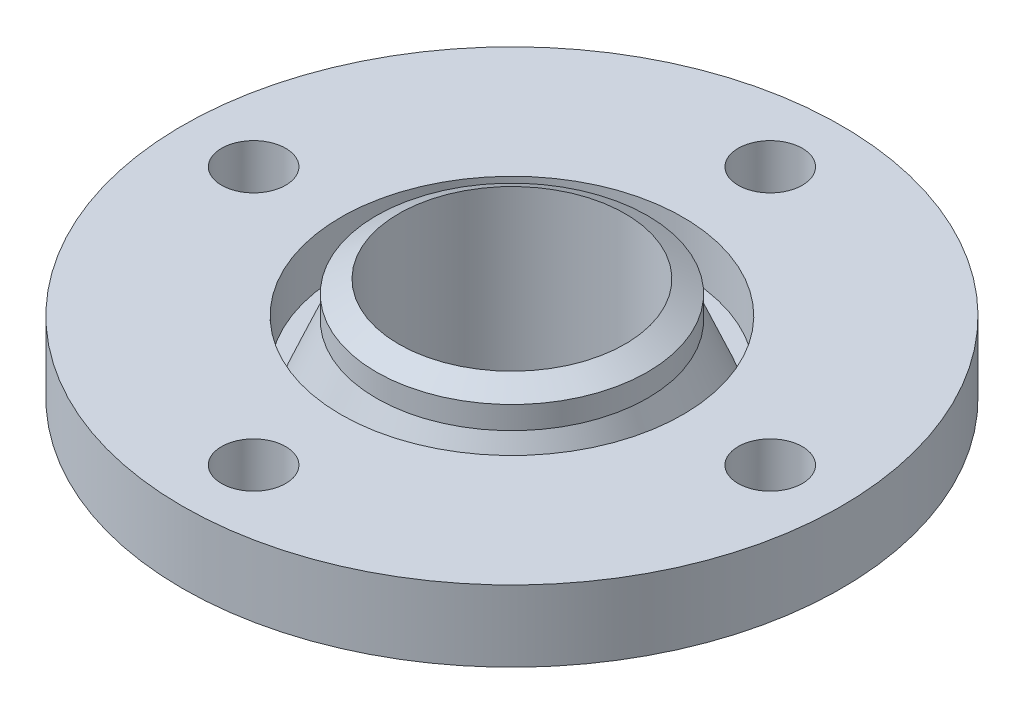
ISO-10303-21;
HEADER;
FILE_DESCRIPTION(('STEP AP214'),'2;1');
FILE_NAME('part.step','',(''),(''),'','','');
FILE_SCHEMA(('AUTOMOTIVE_DESIGN { 1 0 10303 214 1 1 1 1 }'));
ENDSEC;
DATA;
#1=APPLICATION_CONTEXT('core data for automotive mechanical design processes');
#2=APPLICATION_PROTOCOL_DEFINITION('international standard','automotive_design',2000,#1);
#3=PRODUCT_CONTEXT('',#1,'mechanical');
#4=PRODUCT('Part','Part','',(#3));
#5=PRODUCT_RELATED_PRODUCT_CATEGORY('part','',(#4));
#6=PRODUCT_DEFINITION_FORMATION('','',#4);
#7=PRODUCT_DEFINITION_CONTEXT('part definition',#1,'design');
#8=PRODUCT_DEFINITION('design','',#6,#7);
#9=PRODUCT_DEFINITION_SHAPE('','',#8);
#10=(LENGTH_UNIT() NAMED_UNIT(*) SI_UNIT(.MILLI.,.METRE.));
#11=(NAMED_UNIT(*) PLANE_ANGLE_UNIT() SI_UNIT($,.RADIAN.));
#12=(NAMED_UNIT(*) SI_UNIT($,.STERADIAN.) SOLID_ANGLE_UNIT());
#13=UNCERTAINTY_MEASURE_WITH_UNIT(LENGTH_MEASURE(1.E-05),#10,'distance_accuracy_value','');
#14=(GEOMETRIC_REPRESENTATION_CONTEXT(3) GLOBAL_UNCERTAINTY_ASSIGNED_CONTEXT((#13)) GLOBAL_UNIT_ASSIGNED_CONTEXT((#10,
#11,#12)) REPRESENTATION_CONTEXT('',''));
#15=CARTESIAN_POINT('',(0.,0.,0.));
#16=DIRECTION('',(0.,0.,1.));
#17=DIRECTION('',(1.,0.,0.));
#18=AXIS2_PLACEMENT_3D('',#15,#16,#17);
#19=CARTESIAN_POINT('',(0.,0.,0.));
#20=DIRECTION('',(0.,-1.,0.));
#21=DIRECTION('',(0.,0.,-1.));
#22=AXIS2_PLACEMENT_3D('',#19,#20,#21);
#23=CONICAL_SURFACE('',#22,31.75,1.04719755119659);
#24=CARTESIAN_POINT('',(0.,-3.63730669589472,0.));
#25=DIRECTION('',(0.,1.,0.));
#26=DIRECTION('',(0.,0.,1.));
#27=AXIS2_PLACEMENT_3D('',#24,#25,#26);
#28=CIRCLE('',#27,38.05);
#29=CARTESIAN_POINT('',(0.,-3.63730669589472,38.05));
#30=VERTEX_POINT('',#29);
#31=EDGE_CURVE('E10',#30,#30,#28,.T.);
#32=ORIENTED_EDGE('',*,*,#31,.T.);
#33=EDGE_LOOP('',(#32));
#34=FACE_BOUND('',#33,.T.);
#35=CARTESIAN_POINT('',(0.,0.,0.));
#36=DIRECTION('',(0.,1.,0.));
#37=DIRECTION('',(0.,0.,1.));
#38=AXIS2_PLACEMENT_3D('',#35,#36,#37);
#39=CIRCLE('',#38,31.75);
#40=CARTESIAN_POINT('',(0.,0.,31.75));
#41=VERTEX_POINT('',#40);
#42=EDGE_CURVE('E78',#41,#41,#39,.T.);
#43=ORIENTED_EDGE('',*,*,#42,.F.);
#44=EDGE_LOOP('',(#43));
#45=FACE_BOUND('',#44,.T.);
#46=ADVANCED_FACE('F37',(#34,#45),#23,.T.);
#47=CARTESIAN_POINT('',(0.,0.,0.));
#48=DIRECTION('',(0.,1.,0.));
#49=DIRECTION('',(0.,0.,1.));
#50=AXIS2_PLACEMENT_3D('',#47,#48,#49);
#51=CYLINDRICAL_SURFACE('',#50,38.05);
#52=CARTESIAN_POINT('',(0.,-10.,0.));
#53=DIRECTION('',(0.,1.,0.));
#54=DIRECTION('',(0.,0.,1.));
#55=AXIS2_PLACEMENT_3D('',#52,#53,#54);
#56=CIRCLE('',#55,38.05);
#57=CARTESIAN_POINT('',(0.,-10.,38.05));
#58=VERTEX_POINT('',#57);
#59=EDGE_CURVE('E44',#58,#58,#56,.T.);
#60=ORIENTED_EDGE('',*,*,#59,.T.);
#61=EDGE_LOOP('',(#60));
#62=FACE_BOUND('',#61,.T.);
#63=ORIENTED_EDGE('',*,*,#31,.F.);
#64=EDGE_LOOP('',(#63));
#65=FACE_BOUND('',#64,.T.);
#66=ADVANCED_FACE('F122',(#62,#65),#51,.T.);
#67=CARTESIAN_POINT('',(0.,-10.,0.));
#68=DIRECTION('',(0.,-1.,0.));
#69=DIRECTION('',(0.,0.,-1.));
#70=AXIS2_PLACEMENT_3D('',#67,#68,#69);
#71=CONICAL_SURFACE('',#70,38.05,0.396285049494058);
#72=CARTESIAN_POINT('',(0.,-29.,0.));
#73=DIRECTION('',(0.,1.,0.));
#74=DIRECTION('',(0.,0.,1.));
#75=AXIS2_PLACEMENT_3D('',#72,#73,#74);
#76=CIRCLE('',#75,46.);
#77=CARTESIAN_POINT('',(0.,-29.,46.));
#78=VERTEX_POINT('',#77);
#79=EDGE_CURVE('E49',#78,#78,#76,.T.);
#80=ORIENTED_EDGE('',*,*,#79,.T.);
#81=EDGE_LOOP('',(#80));
#82=FACE_BOUND('',#81,.T.);
#83=ORIENTED_EDGE('',*,*,#59,.F.);
#84=EDGE_LOOP('',(#83));
#85=FACE_BOUND('',#84,.T.);
#86=ADVANCED_FACE('F107',(#82,#85),#71,.T.);
#87=CARTESIAN_POINT('',(-54.,-29.,0.));
#88=DIRECTION('',(0.,1.,0.));
#89=DIRECTION('',(0.,0.,1.));
#90=AXIS2_PLACEMENT_3D('',#87,#88,#89);
#91=PLANE('',#90);
#92=CARTESIAN_POINT('',(0.,-29.,0.));
#93=DIRECTION('',(0.,1.,0.));
#94=DIRECTION('',(0.,0.,1.));
#95=AXIS2_PLACEMENT_3D('',#92,#93,#94);
#96=CIRCLE('',#95,54.);
#97=CARTESIAN_POINT('',(0.,-29.,54.));
#98=VERTEX_POINT('',#97);
#99=EDGE_CURVE('E102',#98,#98,#96,.T.);
#100=ORIENTED_EDGE('',*,*,#99,.T.);
#101=EDGE_LOOP('',(#100));
#102=FACE_BOUND('',#101,.T.);
#103=ORIENTED_EDGE('',*,*,#79,.F.);
#104=EDGE_LOOP('',(#103));
#105=FACE_BOUND('',#104,.T.);
#106=ADVANCED_FACE('F110',(#102,#105),#91,.T.);
#107=CARTESIAN_POINT('',(0.,-29.,0.));
#108=DIRECTION('',(0.,-1.,0.));
#109=DIRECTION('',(0.,0.,-1.));
#110=AXIS2_PLACEMENT_3D('',#107,#108,#109);
#111=CONICAL_SURFACE('',#110,54.,0.785398163397453);
#112=CARTESIAN_POINT('',(0.,-23.0000000000001,0.));
#113=DIRECTION('',(0.,1.,0.));
#114=DIRECTION('',(0.,0.,1.));
#115=AXIS2_PLACEMENT_3D('',#112,#113,#114);
#116=CIRCLE('',#115,48.);
#117=CARTESIAN_POINT('',(0.,-23.0000000000001,48.));
#118=VERTEX_POINT('',#117);
#119=EDGE_CURVE('E99',#118,#118,#116,.T.);
#120=ORIENTED_EDGE('',*,*,#119,.T.);
#121=EDGE_LOOP('',(#120));
#122=FACE_BOUND('',#121,.T.);
#123=ORIENTED_EDGE('',*,*,#99,.F.);
#124=EDGE_LOOP('',(#123));
#125=FACE_BOUND('',#124,.T.);
#126=ADVANCED_FACE('F112',(#122,#125),#111,.F.);
#127=CARTESIAN_POINT('',(0.,0.,0.));
#128=DIRECTION('',(0.,1.,0.));
#129=DIRECTION('',(0.,0.,1.));
#130=AXIS2_PLACEMENT_3D('',#127,#128,#129);
#131=CYLINDRICAL_SURFACE('',#130,48.);
#132=CARTESIAN_POINT('',(0.,-9.,0.));
#133=DIRECTION('',(0.,1.,0.));
#134=DIRECTION('',(0.,0.,1.));
#135=AXIS2_PLACEMENT_3D('',#132,#133,#134);
#136=CIRCLE('',#135,48.);
#137=CARTESIAN_POINT('',(0.,-9.,48.));
#138=VERTEX_POINT('',#137);
#139=EDGE_CURVE('E96',#138,#138,#136,.T.);
#140=ORIENTED_EDGE('',*,*,#139,.T.);
#141=EDGE_LOOP('',(#140));
#142=FACE_BOUND('',#141,.T.);
#143=ORIENTED_EDGE('',*,*,#119,.F.);
#144=EDGE_LOOP('',(#143));
#145=FACE_BOUND('',#144,.T.);
#146=ADVANCED_FACE('F119',(#142,#145),#131,.F.);
#147=CARTESIAN_POINT('',(-92.5,-9.,0.));
#148=DIRECTION('',(0.,1.,0.));
#149=DIRECTION('',(0.,0.,1.));
#150=AXIS2_PLACEMENT_3D('',#147,#148,#149);
#151=PLANE('',#150);
#152=CARTESIAN_POINT('',(-7.59397191198381E-13,-9.,72.5));
#153=DIRECTION('',(0.,1.,0.));
#154=DIRECTION('',(0.,0.,1.));
#155=AXIS2_PLACEMENT_3D('',#152,#153,#154);
#156=CIRCLE('',#155,8.99999999999999);
#157=CARTESIAN_POINT('',(-7.59397191198381E-13,-9.,81.5));
#158=VERTEX_POINT('',#157);
#159=EDGE_CURVE('E63',#158,#158,#156,.T.);
#160=ORIENTED_EDGE('',*,*,#159,.F.);
#161=EDGE_LOOP('',(#160));
#162=FACE_BOUND('',#161,.T.);
#163=CARTESIAN_POINT('',(72.5,-9.,5.06264794132254E-13));
#164=DIRECTION('',(0.,1.,0.));
#165=DIRECTION('',(0.,0.,1.));
#166=AXIS2_PLACEMENT_3D('',#163,#164,#165);
#167=CIRCLE('',#166,8.99999999999999);
#168=CARTESIAN_POINT('',(72.5,-9.,9.0000000000005));
#169=VERTEX_POINT('',#168);
#170=EDGE_CURVE('E60',#169,#169,#167,.T.);
#171=ORIENTED_EDGE('',*,*,#170,.F.);
#172=EDGE_LOOP('',(#171));
#173=FACE_BOUND('',#172,.T.);
#174=CARTESIAN_POINT('',(2.53132397066127E-13,-9.,-72.5));
#175=DIRECTION('',(0.,1.,0.));
#176=DIRECTION('',(0.,0.,1.));
#177=AXIS2_PLACEMENT_3D('',#174,#175,#176);
#178=CIRCLE('',#177,8.99999999999999);
#179=CARTESIAN_POINT('',(2.53132397066127E-13,-9.,-63.5));
#180=VERTEX_POINT('',#179);
#181=EDGE_CURVE('E57',#180,#180,#178,.T.);
#182=ORIENTED_EDGE('',*,*,#181,.F.);
#183=EDGE_LOOP('',(#182));
#184=FACE_BOUND('',#183,.T.);
#185=CARTESIAN_POINT('',(-72.5,-9.,0.));
#186=DIRECTION('',(0.,1.,0.));
#187=DIRECTION('',(0.,0.,1.));
#188=AXIS2_PLACEMENT_3D('',#185,#186,#187);
#189=CIRCLE('',#188,8.99999999999999);
#190=CARTESIAN_POINT('',(-72.5,-9.,8.99999999999999));
#191=VERTEX_POINT('',#190);
#192=EDGE_CURVE('E56',#191,#191,#189,.T.);
#193=ORIENTED_EDGE('',*,*,#192,.F.);
#194=EDGE_LOOP('',(#193));
#195=FACE_BOUND('',#194,.T.);
#196=CARTESIAN_POINT('',(0.,-9.,0.));
#197=DIRECTION('',(0.,1.,0.));
#198=DIRECTION('',(0.,0.,1.));
#199=AXIS2_PLACEMENT_3D('',#196,#197,#198);
#200=CIRCLE('',#199,92.5);
#201=CARTESIAN_POINT('',(0.,-9.,92.5));
#202=VERTEX_POINT('',#201);
#203=EDGE_CURVE('E93',#202,#202,#200,.T.);
#204=ORIENTED_EDGE('',*,*,#203,.T.);
#205=EDGE_LOOP('',(#204));
#206=FACE_BOUND('',#205,.T.);
#207=ORIENTED_EDGE('',*,*,#139,.F.);
#208=EDGE_LOOP('',(#207));
#209=FACE_BOUND('',#208,.T.);
#210=ADVANCED_FACE('F161',(#162,#173,#184,#195,#206,#209),#151,.T.);
#211=CARTESIAN_POINT('',(0.,0.,0.));
#212=DIRECTION('',(0.,1.,0.));
#213=DIRECTION('',(0.,0.,1.));
#214=AXIS2_PLACEMENT_3D('',#211,#212,#213);
#215=CYLINDRICAL_SURFACE('',#214,92.5);
#216=CARTESIAN_POINT('',(0.,-29.,0.));
#217=DIRECTION('',(0.,1.,0.));
#218=DIRECTION('',(0.,0.,1.));
#219=AXIS2_PLACEMENT_3D('',#216,#217,#218);
#220=CIRCLE('',#219,92.5);
#221=CARTESIAN_POINT('',(0.,-29.,92.5));
#222=VERTEX_POINT('',#221);
#223=EDGE_CURVE('E90',#222,#222,#220,.T.);
#224=ORIENTED_EDGE('',*,*,#223,.T.);
#225=EDGE_LOOP('',(#224));
#226=FACE_BOUND('',#225,.T.);
#227=ORIENTED_EDGE('',*,*,#203,.F.);
#228=EDGE_LOOP('',(#227));
#229=FACE_BOUND('',#228,.T.);
#230=ADVANCED_FACE('F154',(#226,#229),#215,.T.);
#231=CARTESIAN_POINT('',(-59.,-29.,0.));
#232=DIRECTION('',(0.,-1.,0.));
#233=DIRECTION('',(0.,0.,-1.));
#234=AXIS2_PLACEMENT_3D('',#231,#232,#233);
#235=PLANE('',#234);
#236=CARTESIAN_POINT('',(-7.59397191198381E-13,-29.,72.5));
#237=DIRECTION('',(0.,-1.,0.));
#238=DIRECTION('',(0.,0.,-1.));
#239=AXIS2_PLACEMENT_3D('',#236,#237,#238);
#240=CIRCLE('',#239,8.99999999999999);
#241=CARTESIAN_POINT('',(-7.59397191198381E-13,-29.,63.5));
#242=VERTEX_POINT('',#241);
#243=EDGE_CURVE('E40',#242,#242,#240,.T.);
#244=ORIENTED_EDGE('',*,*,#243,.F.);
#245=EDGE_LOOP('',(#244));
#246=FACE_BOUND('',#245,.T.);
#247=CARTESIAN_POINT('',(72.5,-29.,5.06264794132254E-13));
#248=DIRECTION('',(0.,-1.,0.));
#249=DIRECTION('',(0.,0.,-1.));
#250=AXIS2_PLACEMENT_3D('',#247,#248,#249);
#251=CIRCLE('',#250,8.99999999999999);
#252=CARTESIAN_POINT('',(72.5,-29.,-8.99999999999949));
#253=VERTEX_POINT('',#252);
#254=EDGE_CURVE('E61',#253,#253,#251,.T.);
#255=ORIENTED_EDGE('',*,*,#254,.F.);
#256=EDGE_LOOP('',(#255));
#257=FACE_BOUND('',#256,.T.);
#258=CARTESIAN_POINT('',(2.53132397066127E-13,-29.,-72.5));
#259=DIRECTION('',(0.,-1.,0.));
#260=DIRECTION('',(0.,0.,-1.));
#261=AXIS2_PLACEMENT_3D('',#258,#259,#260);
#262=CIRCLE('',#261,8.99999999999999);
#263=CARTESIAN_POINT('',(2.53132397066127E-13,-29.,-81.5));
#264=VERTEX_POINT('',#263);
#265=EDGE_CURVE('E58',#264,#264,#262,.T.);
#266=ORIENTED_EDGE('',*,*,#265,.F.);
#267=EDGE_LOOP('',(#266));
#268=FACE_BOUND('',#267,.T.);
#269=CARTESIAN_POINT('',(-72.5,-29.,0.));
#270=DIRECTION('',(0.,-1.,0.));
#271=DIRECTION('',(0.,0.,-1.));
#272=AXIS2_PLACEMENT_3D('',#269,#270,#271);
#273=CIRCLE('',#272,8.99999999999999);
#274=CARTESIAN_POINT('',(-72.5,-29.,-8.99999999999999));
#275=VERTEX_POINT('',#274);
#276=EDGE_CURVE('E53',#275,#275,#273,.T.);
#277=ORIENTED_EDGE('',*,*,#276,.F.);
#278=EDGE_LOOP('',(#277));
#279=FACE_BOUND('',#278,.T.);
#280=CARTESIAN_POINT('',(0.,-29.,0.));
#281=DIRECTION('',(0.,1.,0.));
#282=DIRECTION('',(0.,0.,1.));
#283=AXIS2_PLACEMENT_3D('',#280,#281,#282);
#284=CIRCLE('',#283,59.);
#285=CARTESIAN_POINT('',(0.,-29.,59.));
#286=VERTEX_POINT('',#285);
#287=EDGE_CURVE('E87',#286,#286,#284,.T.);
#288=ORIENTED_EDGE('',*,*,#287,.T.);
#289=EDGE_LOOP('',(#288));
#290=FACE_BOUND('',#289,.T.);
#291=ORIENTED_EDGE('',*,*,#223,.F.);
#292=EDGE_LOOP('',(#291));
#293=FACE_BOUND('',#292,.T.);
#294=ADVANCED_FACE('F148',(#246,#257,#268,#279,#290,#293),#235,.T.);
#295=CARTESIAN_POINT('',(0.,0.,0.));
#296=DIRECTION('',(0.,1.,0.));
#297=DIRECTION('',(0.,0.,1.));
#298=AXIS2_PLACEMENT_3D('',#295,#296,#297);
#299=CYLINDRICAL_SURFACE('',#298,59.);
#300=CARTESIAN_POINT('',(0.,-45.,0.));
#301=DIRECTION('',(0.,1.,0.));
#302=DIRECTION('',(0.,0.,1.));
#303=AXIS2_PLACEMENT_3D('',#300,#301,#302);
#304=CIRCLE('',#303,59.);
#305=CARTESIAN_POINT('',(0.,-45.,59.));
#306=VERTEX_POINT('',#305);
#307=EDGE_CURVE('E84',#306,#306,#304,.T.);
#308=ORIENTED_EDGE('',*,*,#307,.T.);
#309=EDGE_LOOP('',(#308));
#310=FACE_BOUND('',#309,.T.);
#311=ORIENTED_EDGE('',*,*,#287,.F.);
#312=EDGE_LOOP('',(#311));
#313=FACE_BOUND('',#312,.T.);
#314=ADVANCED_FACE('F142',(#310,#313),#299,.T.);
#315=CARTESIAN_POINT('',(-31.75,-45.,0.));
#316=DIRECTION('',(0.,-1.,0.));
#317=DIRECTION('',(0.,0.,-1.));
#318=AXIS2_PLACEMENT_3D('',#315,#316,#317);
#319=PLANE('',#318);
#320=CARTESIAN_POINT('',(0.,-45.,0.));
#321=DIRECTION('',(0.,1.,0.));
#322=DIRECTION('',(0.,0.,1.));
#323=AXIS2_PLACEMENT_3D('',#320,#321,#322);
#324=CIRCLE('',#323,31.75);
#325=CARTESIAN_POINT('',(0.,-45.,31.75));
#326=VERTEX_POINT('',#325);
#327=EDGE_CURVE('E81',#326,#326,#324,.T.);
#328=ORIENTED_EDGE('',*,*,#327,.T.);
#329=EDGE_LOOP('',(#328));
#330=FACE_BOUND('',#329,.T.);
#331=ORIENTED_EDGE('',*,*,#307,.F.);
#332=EDGE_LOOP('',(#331));
#333=FACE_BOUND('',#332,.T.);
#334=ADVANCED_FACE('F136',(#330,#333),#319,.T.);
#335=CARTESIAN_POINT('',(0.,0.,0.));
#336=DIRECTION('',(0.,1.,0.));
#337=DIRECTION('',(0.,0.,1.));
#338=AXIS2_PLACEMENT_3D('',#335,#336,#337);
#339=CYLINDRICAL_SURFACE('',#338,31.75);
#340=ORIENTED_EDGE('',*,*,#42,.T.);
#341=EDGE_LOOP('',(#340));
#342=FACE_BOUND('',#341,.T.);
#343=ORIENTED_EDGE('',*,*,#327,.F.);
#344=EDGE_LOOP('',(#343));
#345=FACE_BOUND('',#344,.T.);
#346=ADVANCED_FACE('F132',(#342,#345),#339,.F.);
#347=CARTESIAN_POINT('',(-72.5,10.8053681211576,0.));
#348=DIRECTION('',(0.,1.,0.));
#349=DIRECTION('',(-1.,0.,0.));
#350=AXIS2_PLACEMENT_3D('',#347,#348,#349);
#351=CYLINDRICAL_SURFACE('',#350,8.99999999999999);
#352=ORIENTED_EDGE('',*,*,#192,.T.);
#353=EDGE_LOOP('',(#352));
#354=FACE_BOUND('',#353,.T.);
#355=ORIENTED_EDGE('',*,*,#276,.T.);
#356=EDGE_LOOP('',(#355));
#357=FACE_BOUND('',#356,.T.);
#358=ADVANCED_FACE('F135',(#354,#357),#351,.F.);
#359=CARTESIAN_POINT('',(2.53132397066127E-13,10.8053681211576,-72.5));
#360=DIRECTION('',(0.,1.,0.));
#361=DIRECTION('',(0.,0.,-1.));
#362=AXIS2_PLACEMENT_3D('',#359,#360,#361);
#363=CYLINDRICAL_SURFACE('',#362,8.99999999999999);
#364=ORIENTED_EDGE('',*,*,#181,.T.);
#365=EDGE_LOOP('',(#364));
#366=FACE_BOUND('',#365,.T.);
#367=ORIENTED_EDGE('',*,*,#265,.T.);
#368=EDGE_LOOP('',(#367));
#369=FACE_BOUND('',#368,.T.);
#370=ADVANCED_FACE('F182',(#366,#369),#363,.F.);
#371=CARTESIAN_POINT('',(72.5,10.8053681211576,5.06264794132254E-13));
#372=DIRECTION('',(0.,1.,0.));
#373=DIRECTION('',(1.,0.,0.));
#374=AXIS2_PLACEMENT_3D('',#371,#372,#373);
#375=CYLINDRICAL_SURFACE('',#374,8.99999999999999);
#376=ORIENTED_EDGE('',*,*,#170,.T.);
#377=EDGE_LOOP('',(#376));
#378=FACE_BOUND('',#377,.T.);
#379=ORIENTED_EDGE('',*,*,#254,.T.);
#380=EDGE_LOOP('',(#379));
#381=FACE_BOUND('',#380,.T.);
#382=ADVANCED_FACE('F186',(#378,#381),#375,.F.);
#383=CARTESIAN_POINT('',(-7.59397191198381E-13,10.8053681211576,72.5));
#384=DIRECTION('',(0.,1.,0.));
#385=DIRECTION('',(0.,0.,1.));
#386=AXIS2_PLACEMENT_3D('',#383,#384,#385);
#387=CYLINDRICAL_SURFACE('',#386,8.99999999999999);
#388=ORIENTED_EDGE('',*,*,#159,.T.);
#389=EDGE_LOOP('',(#388));
#390=FACE_BOUND('',#389,.T.);
#391=ORIENTED_EDGE('',*,*,#243,.T.);
#392=EDGE_LOOP('',(#391));
#393=FACE_BOUND('',#392,.T.);
#394=ADVANCED_FACE('F190',(#390,#393),#387,.F.);
#395=CLOSED_SHELL('',(#46,#66,#86,#106,#126,#146,#210,#230,#294,#314,#334,#346,#358,#370,#382,#394));
#396=MANIFOLD_SOLID_BREP('B2',#395);
#397=ADVANCED_BREP_SHAPE_REPRESENTATION('',(#18,#396),#14);
#398=SHAPE_DEFINITION_REPRESENTATION(#9,#397);
ENDSEC;
END-ISO-10303-21;
